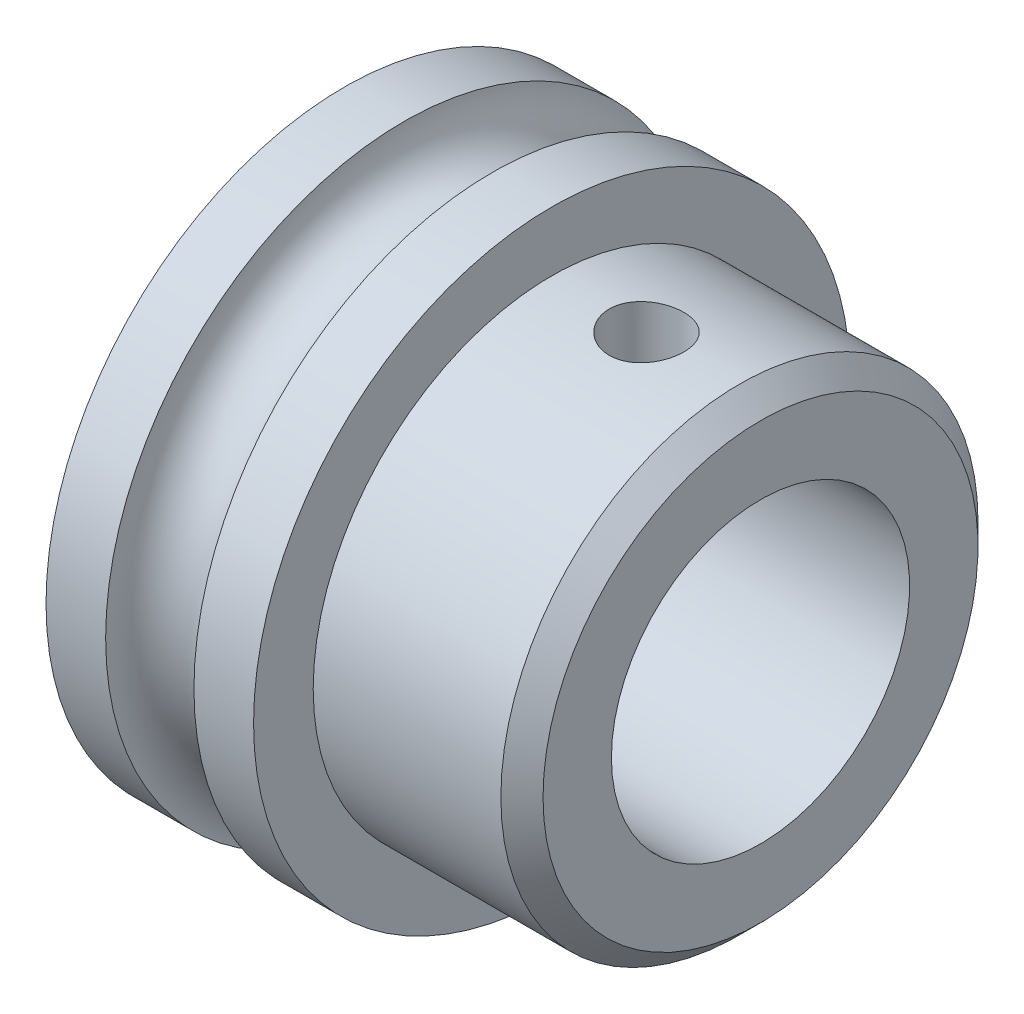
ISO-10303-21;
HEADER;
FILE_DESCRIPTION(('STEP AP214'),'2;1');
FILE_NAME('part.step','',(''),(''),'','','');
FILE_SCHEMA(('AUTOMOTIVE_DESIGN { 1 0 10303 214 1 1 1 1 }'));
ENDSEC;
DATA;
#1=APPLICATION_CONTEXT('core data for automotive mechanical design processes');
#2=APPLICATION_PROTOCOL_DEFINITION('international standard','automotive_design',2000,#1);
#3=PRODUCT_CONTEXT('',#1,'mechanical');
#4=PRODUCT('Part','Part','',(#3));
#5=PRODUCT_RELATED_PRODUCT_CATEGORY('part','',(#4));
#6=PRODUCT_DEFINITION_FORMATION('','',#4);
#7=PRODUCT_DEFINITION_CONTEXT('part definition',#1,'design');
#8=PRODUCT_DEFINITION('design','',#6,#7);
#9=PRODUCT_DEFINITION_SHAPE('','',#8);
#10=(LENGTH_UNIT() NAMED_UNIT(*) SI_UNIT(.MILLI.,.METRE.));
#11=(NAMED_UNIT(*) PLANE_ANGLE_UNIT() SI_UNIT($,.RADIAN.));
#12=(NAMED_UNIT(*) SI_UNIT($,.STERADIAN.) SOLID_ANGLE_UNIT());
#13=UNCERTAINTY_MEASURE_WITH_UNIT(LENGTH_MEASURE(1.E-05),#10,'distance_accuracy_value','');
#14=(GEOMETRIC_REPRESENTATION_CONTEXT(3) GLOBAL_UNCERTAINTY_ASSIGNED_CONTEXT((#13)) GLOBAL_UNIT_ASSIGNED_CONTEXT((#10,
#11,#12)) REPRESENTATION_CONTEXT('',''));
#15=CARTESIAN_POINT('',(0.,0.,0.));
#16=DIRECTION('',(0.,0.,1.));
#17=DIRECTION('',(1.,0.,0.));
#18=AXIS2_PLACEMENT_3D('',#15,#16,#17);
#19=CARTESIAN_POINT('',(-10.922,0.,0.));
#20=DIRECTION('',(-1.,0.,0.));
#21=DIRECTION('',(0.,0.,1.));
#22=AXIS2_PLACEMENT_3D('',#19,#20,#21);
#23=CYLINDRICAL_SURFACE('',#22,5.08000000000001);
#24=CARTESIAN_POINT('',(-0.449012806053457,0.,0.));
#25=DIRECTION('',(-1.,0.,0.));
#26=DIRECTION('',(0.,0.,1.));
#27=AXIS2_PLACEMENT_3D('',#24,#25,#26);
#28=CIRCLE('',#27,5.08000000000001);
#29=CARTESIAN_POINT('',(-0.449012806053457,0.,5.08000000000001));
#30=VERTEX_POINT('',#29);
#31=EDGE_CURVE('E10',#30,#30,#28,.T.);
#32=ORIENTED_EDGE('',*,*,#31,.T.);
#33=EDGE_LOOP('',(#32));
#34=FACE_BOUND('',#33,.T.);
#35=CARTESIAN_POINT('',(-4.445,0.,0.));
#36=DIRECTION('',(-1.,0.,0.));
#37=DIRECTION('',(0.,0.,1.));
#38=AXIS2_PLACEMENT_3D('',#35,#36,#37);
#39=CIRCLE('',#38,5.08000000000001);
#40=CARTESIAN_POINT('',(-4.445,0.,5.08000000000001));
#41=VERTEX_POINT('',#40);
#42=EDGE_CURVE('E67',#41,#41,#39,.T.);
#43=ORIENTED_EDGE('',*,*,#42,.F.);
#44=EDGE_LOOP('',(#43));
#45=FACE_BOUND('',#44,.T.);
#46=CARTESIAN_POINT('',(-2.42718555586603,5.01760509979612,-0.79375));
#47=CARTESIAN_POINT('',(-2.47147787848491,5.01760586359787,-0.793748187643971));
#48=CARTESIAN_POINT('',(-2.51579536011815,5.01819792782707,-0.790030099333588));
#49=CARTESIAN_POINT('',(-2.60318965806246,5.02050040809539,-0.775260843575477));
#50=CARTESIAN_POINT('',(-2.64626524707835,5.0222118933411,-0.76420266514579));
#51=CARTESIAN_POINT('',(-2.72989818058234,5.02655474595517,-0.735093513448723));
#52=CARTESIAN_POINT('',(-2.77045749056613,5.0291853844317,-0.717048079876853));
#53=CARTESIAN_POINT('',(-2.84796731870727,5.03506927270158,-0.674489989017282));
#54=CARTESIAN_POINT('',(-2.88491829980263,5.03832244246708,-0.649978162846328));
#55=CARTESIAN_POINT('',(-2.95448843990186,5.04511639728294,-0.594956043102074));
#56=CARTESIAN_POINT('',(-2.987071746988,5.04865921890405,-0.564400663860542));
#57=CARTESIAN_POINT('',(-3.04667067085245,5.05561514537724,-0.498256182135875));
#58=CARTESIAN_POINT('',(-3.07368597299222,5.05902824288993,-0.462666795380998));
#59=CARTESIAN_POINT('',(-3.12151515432662,5.06536155821058,-0.387233887664786));
#60=CARTESIAN_POINT('',(-3.14229588712793,5.06827910701873,-0.347369106618438));
#61=CARTESIAN_POINT('',(-3.17685320649123,5.07326999984102,-0.264661704544836));
#62=CARTESIAN_POINT('',(-3.19063019400502,5.07534339218025,-0.221819254143437));
#63=CARTESIAN_POINT('',(-3.21067989913461,5.07839798574061,-0.134742340829997));
#64=CARTESIAN_POINT('',(-3.21701273194523,5.07938793177102,-0.0905220313510382));
#65=CARTESIAN_POINT('',(-3.22218112211485,5.08019409086453,-0.00163612307733776));
#66=CARTESIAN_POINT('',(-3.22101712998274,5.08001037445687,0.0430294487990672));
#67=CARTESIAN_POINT('',(-3.21127214927281,5.07849687212833,0.131127528486783));
#68=CARTESIAN_POINT('',(-3.20275584278423,5.07717708113475,0.174567387267618));
#69=CARTESIAN_POINT('',(-3.17864962677835,5.07355085730803,0.259393809171559));
#70=CARTESIAN_POINT('',(-3.16305952278859,5.07124439734955,0.300780315809316));
#71=CARTESIAN_POINT('',(-3.12518274513046,5.0658868659844,0.38051975800661));
#72=CARTESIAN_POINT('',(-3.10286905164265,5.06283279967108,0.418859649553083));
#73=CARTESIAN_POINT('',(-3.05219825026624,5.05632004678997,0.491275324448952));
#74=CARTESIAN_POINT('',(-3.02384071131032,5.0528613313692,0.525350803370853));
#75=CARTESIAN_POINT('',(-2.96152742372027,5.04588106346142,0.588651980301074));
#76=CARTESIAN_POINT('',(-2.92751517928566,5.04235923425492,0.617822061321512));
#77=CARTESIAN_POINT('',(-2.85504932907945,5.03568555295707,0.670049542700766));
#78=CARTESIAN_POINT('',(-2.81659569135901,5.03253370352747,0.693106899084214));
#79=CARTESIAN_POINT('',(-2.73627827394244,5.02695683969123,0.732463167518301));
#80=CARTESIAN_POINT('',(-2.69441147078021,5.02453247880704,0.74875600783221));
#81=CARTESIAN_POINT('',(-2.60848921640204,5.0206963654626,0.774062914430346));
#82=CARTESIAN_POINT('',(-2.56443393355639,5.01928453523211,0.783077539744943));
#83=CARTESIAN_POINT('',(-2.47588113307615,5.01764819737613,0.793495108580192));
#84=CARTESIAN_POINT('',(-2.43139312930419,5.01741136725904,0.794977053080785));
#85=CARTESIAN_POINT('',(-2.34280433165894,5.01811909052553,0.790497145930359));
#86=CARTESIAN_POINT('',(-2.29870352476042,5.0190636040144,0.784535545652492));
#87=CARTESIAN_POINT('',(-2.21238797699542,5.02201624833965,0.765404909864968));
#88=CARTESIAN_POINT('',(-2.17016422629796,5.0240185232959,0.752275542632783));
#89=CARTESIAN_POINT('',(-2.08851657004054,5.02885622496,0.719223454368133));
#90=CARTESIAN_POINT('',(-2.04909281362496,5.03169169600756,0.699300371789363));
#91=CARTESIAN_POINT('',(-1.97381102394253,5.03790519025758,0.653037807365681));
#92=CARTESIAN_POINT('',(-1.93798465819029,5.04128744553475,0.62664737222177));
#93=CARTESIAN_POINT('',(-1.87124083944672,5.04820080241047,0.568269735935022));
#94=CARTESIAN_POINT('',(-1.84032368869579,5.05173191315651,0.536282190455509));
#95=CARTESIAN_POINT('',(-1.78399047743927,5.05858379592671,0.46726966098144));
#96=CARTESIAN_POINT('',(-1.75862689284948,5.06190236798872,0.430201591204772));
#97=CARTESIAN_POINT('',(-1.71448710826913,5.06792067865716,0.352284858768145));
#98=CARTESIAN_POINT('',(-1.69571071578144,5.07062043534638,0.31143630662909));
#99=CARTESIAN_POINT('',(-1.66536136346331,5.07508731512396,0.227279093249617));
#100=CARTESIAN_POINT('',(-1.65376016042902,5.07685809066192,0.183980819368424));
#101=CARTESIAN_POINT('',(-1.63799925874241,5.07928286208152,0.0960208740522106));
#102=CARTESIAN_POINT('',(-1.63383902491051,5.07993693827978,0.0513593009052815));
#103=CARTESIAN_POINT('',(-1.633092067648,5.08005368965632,-0.037551412447278));
#104=CARTESIAN_POINT('',(-1.63642521694196,5.07952896982697,-0.0817998836629871));
#105=CARTESIAN_POINT('',(-1.65039809375328,5.07737261769528,-0.169098784060097));
#106=CARTESIAN_POINT('',(-1.66103779186615,5.0757409898476,-0.212149218062157));
#107=CARTESIAN_POINT('',(-1.68929246082473,5.07155336151322,-0.295804860011351));
#108=CARTESIAN_POINT('',(-1.70690142099309,5.06899815773382,-0.336412140393966));
#109=CARTESIAN_POINT('',(-1.74858608709666,5.06324340508888,-0.414108288028914));
#110=CARTESIAN_POINT('',(-1.77266203857992,5.06004383175813,-0.45119702161162));
#111=CARTESIAN_POINT('',(-1.82688495408511,5.05331502106095,-0.521208695915139));
#112=CARTESIAN_POINT('',(-1.85709091065915,5.04978277424563,-0.554085663107412));
#113=CARTESIAN_POINT('',(-1.92259231731843,5.04280845886785,-0.614333012939016));
#114=CARTESIAN_POINT('',(-1.95788895880768,5.03936641163882,-0.641702102934607));
#115=CARTESIAN_POINT('',(-2.03282550647854,5.03293950694832,-0.690308981147045));
#116=CARTESIAN_POINT('',(-2.07249073524508,5.02995758455756,-0.711508115170812));
#117=CARTESIAN_POINT('',(-2.15484777748423,5.02482305123286,-0.746911020803771));
#118=CARTESIAN_POINT('',(-2.19753644097602,5.02266959178294,-0.761121953937972));
#119=CARTESIAN_POINT('',(-2.27153744821669,5.01992613196976,-0.778970079589324));
#120=CARTESIAN_POINT('',(-2.30239586386009,5.01906044059113,-0.784503921449308));
#121=CARTESIAN_POINT('',(-2.36456051634939,5.01789965866719,-0.791894495325261));
#122=CARTESIAN_POINT('',(-2.39586674659206,5.01760455971695,-0.793751281504998));
#123=CARTESIAN_POINT('',(-2.42718555586603,5.01760509979612,-0.79375));
#124=B_SPLINE_CURVE_WITH_KNOTS('',3,(#46,#47,#48,#49,#50,#51,#52,#53,#54,#55,#56,#57,#58,#59,
#60,#61,#62,#63,#64,#65,#66,#67,#68,#69,#70,#71,#72,#73,#74,#75,#76,#77,#78,#79,#80,#81,#82,#83,
#84,#85,#86,#87,#88,#89,#90,#91,#92,#93,#94,#95,#96,#97,#98,#99,#100,#101,#102,#103,#104,#105,
#106,#107,#108,#109,#110,#111,#112,#113,#114,#115,#116,#117,#118,#119,#120,#121,#122,#123),
.UNSPECIFIED.,.T.,.F.,(4,2,2,2,2,2,2,2,2,2,2,2,2,2,2,2,2,2,2,2,2,2,2,2,2,2,2,2,2,2,2,2,2,2,2,2,
2,2,4),(0.,0.132762475102721,0.265651942830155,0.398436267010929,0.531203532908968,
0.665001394300081,0.798806814310615,0.933311500208673,1.06780848508856,1.201211712106,
1.33460692255917,1.46684040879163,1.59907753060016,1.73185332104328,1.8646385846719,
1.99884043776792,2.13304325629522,2.2673662743606,2.40167897426527,2.53458008459729,
2.66747670689726,2.79964519269812,2.93182071330755,3.0650730952453,3.19833367781194,
3.33280376108561,3.46726991442069,3.60120335202525,3.73512715629804,3.86762572316967,
4.00012375681678,4.13250776497607,4.2648968003928,4.39862607826364,4.53238670455244,
4.66696812876592,4.80141134468758,4.89528819827329,4.98916366902383),.UNSPECIFIED.);
#125=CARTESIAN_POINT('',(-2.42718555586603,5.01760509979612,-0.79375));
#126=VERTEX_POINT('',#125);
#127=EDGE_CURVE('E70',#126,#126,#124,.T.);
#128=ORIENTED_EDGE('',*,*,#127,.F.);
#129=EDGE_LOOP('',(#128));
#130=FACE_BOUND('',#129,.T.);
#131=ADVANCED_FACE('F31',(#34,#45,#130),#23,.T.);
#132=CARTESIAN_POINT('',(-10.922,0.,0.));
#133=DIRECTION('',(-1.,0.,0.));
#134=DIRECTION('',(0.,0.,1.));
#135=AXIS2_PLACEMENT_3D('',#132,#133,#134);
#136=CYLINDRICAL_SURFACE('',#135,3.175);
#137=CARTESIAN_POINT('',(-8.8646,0.,0.));
#138=DIRECTION('',(-1.,0.,0.));
#139=DIRECTION('',(0.,0.,1.));
#140=AXIS2_PLACEMENT_3D('',#137,#138,#139);
#141=CIRCLE('',#140,3.175);
#142=CARTESIAN_POINT('',(-8.8646,0.,3.175));
#143=VERTEX_POINT('',#142);
#144=EDGE_CURVE('E52',#143,#143,#141,.T.);
#145=ORIENTED_EDGE('',*,*,#144,.T.);
#146=EDGE_LOOP('',(#145));
#147=FACE_BOUND('',#146,.T.);
#148=CARTESIAN_POINT('',(0.,0.,0.));
#149=DIRECTION('',(-1.,0.,0.));
#150=DIRECTION('',(0.,0.,1.));
#151=AXIS2_PLACEMENT_3D('',#148,#149,#150);
#152=CIRCLE('',#151,3.175);
#153=CARTESIAN_POINT('',(0.,0.,3.175));
#154=VERTEX_POINT('',#153);
#155=EDGE_CURVE('E47',#154,#154,#152,.T.);
#156=ORIENTED_EDGE('',*,*,#155,.F.);
#157=EDGE_LOOP('',(#156));
#158=FACE_BOUND('',#157,.T.);
#159=CARTESIAN_POINT('',(-2.42718555586603,3.07418053105214,-0.79375));
#160=CARTESIAN_POINT('',(-2.38335444245783,3.07418136795391,-0.793748754954467));
#161=CARTESIAN_POINT('',(-2.33950955056739,3.07512817233802,-0.790107082952655));
#162=CARTESIAN_POINT('',(-2.25307884982514,3.07880341258223,-0.775659842341841));
#163=CARTESIAN_POINT('',(-2.21049378882818,3.08153288532631,-0.764850104391599));
#164=CARTESIAN_POINT('',(-2.12784543248131,3.08844545039078,-0.736438455880647));
#165=CARTESIAN_POINT('',(-2.08777895902831,3.09262666548804,-0.718845313593124));
#166=CARTESIAN_POINT('',(-2.01116186018738,3.10196925974547,-0.677392962351167));
#167=CARTESIAN_POINT('',(-1.97461138415631,3.10713068051635,-0.653533487368201));
#168=CARTESIAN_POINT('',(-1.90525948349451,3.11797927441417,-0.599664925671336));
#169=CARTESIAN_POINT('',(-1.87254683775468,3.12367484744913,-0.569543211845986));
#170=CARTESIAN_POINT('',(-1.81258131315683,3.13487712976506,-0.50424780535201));
#171=CARTESIAN_POINT('',(-1.78532894473118,3.14038382134936,-0.469073640902261));
#172=CARTESIAN_POINT('',(-1.73669434489304,3.15068081927675,-0.394063601342555));
#173=CARTESIAN_POINT('',(-1.71539932762475,3.15546005749659,-0.354169527941947));
#174=CARTESIAN_POINT('',(-1.67985099384744,3.16366782786529,-0.271228561012956));
#175=CARTESIAN_POINT('',(-1.66559663838286,3.16709655928662,-0.228182133738942));
#176=CARTESIAN_POINT('',(-1.64481861838732,3.1721576093429,-0.141083905904446));
#177=CARTESIAN_POINT('',(-1.63814419379234,3.17382491295568,-0.0970701384567997));
#178=CARTESIAN_POINT('',(-1.63224227044604,3.17529716129069,-0.00851815011592975));
#179=CARTESIAN_POINT('',(-1.63301367068948,3.17510238135704,0.0360199922658365));
#180=CARTESIAN_POINT('',(-1.64187307082045,3.17289845147747,0.123310846193082));
#181=CARTESIAN_POINT('',(-1.64979833907063,3.17092965743227,0.166081246133347));
#182=CARTESIAN_POINT('',(-1.67247893410643,3.16544590596641,0.249664733884613));
#183=CARTESIAN_POINT('',(-1.68723462447336,3.16193086624005,0.290477717375285));
#184=CARTESIAN_POINT('',(-1.72328887205917,3.15368784330034,0.369416570904559));
#185=CARTESIAN_POINT('',(-1.74464534254613,3.14894918753179,0.407514829627163));
#186=CARTESIAN_POINT('',(-1.79325098398544,3.13877294459564,0.479643775232763));
#187=CARTESIAN_POINT('',(-1.82050118013403,3.13333523589666,0.51367375284912));
#188=CARTESIAN_POINT('',(-1.88099308144543,3.12217979121823,0.577670640348684));
#189=CARTESIAN_POINT('',(-1.91437698418645,3.11645845949479,0.607502657765939));
#190=CARTESIAN_POINT('',(-1.98573354746506,3.10551526316554,0.661174998420646));
#191=CARTESIAN_POINT('',(-2.02370642235442,3.10029342191146,0.685015041611525));
#192=CARTESIAN_POINT('',(-2.10342764170833,3.09092757744048,0.726113077411687));
#193=CARTESIAN_POINT('',(-2.14519340024047,3.08678892332916,0.743338593782827));
#194=CARTESIAN_POINT('',(-2.2311564419803,3.08012668244436,0.770481711380095));
#195=CARTESIAN_POINT('',(-2.27535320268067,3.07760275007244,0.780400876451372));
#196=CARTESIAN_POINT('',(-2.36367269759962,3.07452825542427,0.792425910276193));
#197=CARTESIAN_POINT('',(-2.40776655524819,3.07392733287233,0.794731225469482));
#198=CARTESIAN_POINT('',(-2.49570902072959,3.0746298155523,0.792009144488686));
#199=CARTESIAN_POINT('',(-2.53955765076555,3.07593304548402,0.786982423316994));
#200=CARTESIAN_POINT('',(-2.62502433498915,3.08024873520573,0.769913834800208));
#201=CARTESIAN_POINT('',(-2.66666714655227,3.08323288049414,0.757988091679454));
#202=CARTESIAN_POINT('',(-2.74736254373394,3.09054728051031,0.727588740930422));
#203=CARTESIAN_POINT('',(-2.7864148218661,3.09487769468935,0.709114357648733));
#204=CARTESIAN_POINT('',(-2.86166566158891,3.10450273527111,0.665724687069857));
#205=CARTESIAN_POINT('',(-2.89779321257971,3.10981461032609,0.640690156842812));
#206=CARTESIAN_POINT('',(-2.96540786105546,3.1207617387527,0.585041607516725));
#207=CARTESIAN_POINT('',(-2.99689419440243,3.12639704516289,0.554426671501818));
#208=CARTESIAN_POINT('',(-3.05514056188231,3.13752675462535,0.487571034781626));
#209=CARTESIAN_POINT('',(-3.08176262572528,3.14301410404633,0.451208737321952));
#210=CARTESIAN_POINT('',(-3.12852269362305,3.15308366274861,0.374414004388899));
#211=CARTESIAN_POINT('',(-3.14866103588913,3.15766591923757,0.333981781360088));
#212=CARTESIAN_POINT('',(-3.18170717182865,3.16538011746915,0.250474322624053));
#213=CARTESIAN_POINT('',(-3.19466696615638,3.16852246032115,0.207420671190881));
#214=CARTESIAN_POINT('',(-3.2131442121042,3.17304830653163,0.119657622253054));
#215=CARTESIAN_POINT('',(-3.21866310001568,3.17443214932407,0.0749485460014873));
#216=CARTESIAN_POINT('',(-3.22202108009161,3.17527121968244,-0.0135600491143901));
#217=CARTESIAN_POINT('',(-3.22006378746049,3.17477758236007,-0.0573514751542887));
#218=CARTESIAN_POINT('',(-3.20899134295115,3.1720305531308,-0.143960450279199));
#219=CARTESIAN_POINT('',(-3.19987640394938,3.16977721355944,-0.186778028288579));
#220=CARTESIAN_POINT('',(-3.17485660642286,3.16377187327833,-0.270010759543073));
#221=CARTESIAN_POINT('',(-3.15898856479755,3.16002800573993,-0.310437605073684));
#222=CARTESIAN_POINT('',(-3.12094640876944,3.15143585574997,-0.388077910851665));
#223=CARTESIAN_POINT('',(-3.09877149943456,3.14658743409321,-0.425290965254134));
#224=CARTESIAN_POINT('',(-3.04812408888085,3.13616379434565,-0.496412780686471));
#225=CARTESIAN_POINT('',(-3.0195134424333,3.13057394700607,-0.530221021963591));
#226=CARTESIAN_POINT('',(-2.95707491711182,3.11936327685983,-0.592625672340306));
#227=CARTESIAN_POINT('',(-2.92324571746328,3.11374244655986,-0.621220758022866));
#228=CARTESIAN_POINT('',(-2.85057068334375,3.10298683964417,-0.672911108517897));
#229=CARTESIAN_POINT('',(-2.81164303290737,3.09786308710998,-0.695893816685733));
#230=CARTESIAN_POINT('',(-2.73035401073977,3.088830147179,-0.73495447418865));
#231=CARTESIAN_POINT('',(-2.68799516401837,3.08492007669321,-0.751037447121648));
#232=CARTESIAN_POINT('',(-2.60929005272892,3.07936827563419,-0.773447882048922));
#233=CARTESIAN_POINT('',(-2.57332035663753,3.07743751260823,-0.781044579160439));
#234=CARTESIAN_POINT('',(-2.50063214109611,3.07484334373159,-0.791195944729675));
#235=CARTESIAN_POINT('',(-2.46391368579209,3.07417982977319,-0.793751043281599));
#236=CARTESIAN_POINT('',(-2.42718555586603,3.07418053105214,-0.79375));
#237=B_SPLINE_CURVE_WITH_KNOTS('',3,(#159,#160,#161,#162,#163,#164,#165,#166,#167,#168,#169,
#170,#171,#172,#173,#174,#175,#176,#177,#178,#179,#180,#181,#182,#183,#184,#185,#186,#187,#188,
#189,#190,#191,#192,#193,#194,#195,#196,#197,#198,#199,#200,#201,#202,#203,#204,#205,#206,#207,
#208,#209,#210,#211,#212,#213,#214,#215,#216,#217,#218,#219,#220,#221,#222,#223,#224,#225,#226,
#227,#228,#229,#230,#231,#232,#233,#234,#235,#236),.UNSPECIFIED.,.T.,.F.,(4,2,2,2,2,2,2,2,2,2,2,
2,2,2,2,2,2,2,2,2,2,2,2,2,2,2,2,2,2,2,2,2,2,2,2,2,2,2,4),(0.,0.131358462735963,0.26279339787403,
0.39405900584564,0.525330187419073,0.659206054533127,0.793094430669005,0.928851001033824,
1.06458753248495,1.19757428438065,1.33054137198504,1.46055798400783,1.59058151757162,
1.72177987572829,1.85300107383423,1.98777373133625,2.1225526865298,2.25798517159711,
2.39338866038174,2.52521584983888,2.657030903779,2.78668926087466,2.91636298048343,
3.04858053557325,3.18081983493044,3.31636792578531,3.45190894488001,3.58645483113243,
3.72097474275662,3.8518574414251,3.98273624764234,4.11291048304751,4.24310113318881,
4.3764107816185,4.50975422519092,4.64558531534928,4.78131734030944,4.89139810125845,
5.00146947091141),.UNSPECIFIED.);
#238=CARTESIAN_POINT('',(-2.42718555586603,3.07418053105214,-0.79375));
#239=VERTEX_POINT('',#238);
#240=EDGE_CURVE('E35',#239,#239,#237,.T.);
#241=ORIENTED_EDGE('',*,*,#240,.F.);
#242=EDGE_LOOP('',(#241));
#243=FACE_BOUND('',#242,.T.);
#244=ADVANCED_FACE('F100',(#147,#158,#243),#136,.F.);
#245=CARTESIAN_POINT('',(0.,0.,0.));
#246=DIRECTION('',(-1.,0.,0.));
#247=DIRECTION('',(0.,0.,1.));
#248=AXIS2_PLACEMENT_3D('',#245,#246,#247);
#249=CONICAL_SURFACE('',#248,4.63098719394654,0.785398163397455);
#250=ORIENTED_EDGE('',*,*,#31,.F.);
#251=EDGE_LOOP('',(#250));
#252=FACE_BOUND('',#251,.T.);
#253=CARTESIAN_POINT('',(0.,0.,0.));
#254=DIRECTION('',(-1.,0.,0.));
#255=DIRECTION('',(0.,0.,1.));
#256=AXIS2_PLACEMENT_3D('',#253,#254,#255);
#257=CIRCLE('',#256,4.63098719394654);
#258=CARTESIAN_POINT('',(0.,0.,4.63098719394654));
#259=VERTEX_POINT('',#258);
#260=EDGE_CURVE('E43',#259,#259,#257,.T.);
#261=ORIENTED_EDGE('',*,*,#260,.T.);
#262=EDGE_LOOP('',(#261));
#263=FACE_BOUND('',#262,.T.);
#264=ADVANCED_FACE('F104',(#252,#263),#249,.T.);
#265=CARTESIAN_POINT('',(0.,0.,-3.175));
#266=DIRECTION('',(-1.,0.,0.));
#267=DIRECTION('',(0.,0.,1.));
#268=AXIS2_PLACEMENT_3D('',#265,#266,#267);
#269=PLANE('',#268);
#270=ORIENTED_EDGE('',*,*,#260,.F.);
#271=EDGE_LOOP('',(#270));
#272=FACE_BOUND('',#271,.T.);
#273=ORIENTED_EDGE('',*,*,#155,.T.);
#274=EDGE_LOOP('',(#273));
#275=FACE_BOUND('',#274,.T.);
#276=ADVANCED_FACE('F98',(#272,#275),#269,.F.);
#277=CARTESIAN_POINT('',(-8.8646,0.,-6.35));
#278=DIRECTION('',(1.,0.,0.));
#279=DIRECTION('',(0.,0.,-1.));
#280=AXIS2_PLACEMENT_3D('',#277,#278,#279);
#281=PLANE('',#280);
#282=ORIENTED_EDGE('',*,*,#144,.F.);
#283=EDGE_LOOP('',(#282));
#284=FACE_BOUND('',#283,.T.);
#285=CARTESIAN_POINT('',(-8.8646,0.,0.));
#286=DIRECTION('',(-1.,0.,0.));
#287=DIRECTION('',(0.,0.,1.));
#288=AXIS2_PLACEMENT_3D('',#285,#286,#287);
#289=CIRCLE('',#288,6.35);
#290=CARTESIAN_POINT('',(-8.8646,0.,6.35));
#291=VERTEX_POINT('',#290);
#292=EDGE_CURVE('E55',#291,#291,#289,.T.);
#293=ORIENTED_EDGE('',*,*,#292,.T.);
#294=EDGE_LOOP('',(#293));
#295=FACE_BOUND('',#294,.T.);
#296=ADVANCED_FACE('F95',(#284,#295),#281,.F.);
#297=CARTESIAN_POINT('',(-10.922,0.,0.));
#298=DIRECTION('',(-1.,0.,0.));
#299=DIRECTION('',(0.,0.,1.));
#300=AXIS2_PLACEMENT_3D('',#297,#298,#299);
#301=CYLINDRICAL_SURFACE('',#300,6.35);
#302=ORIENTED_EDGE('',*,*,#292,.F.);
#303=EDGE_LOOP('',(#302));
#304=FACE_BOUND('',#303,.T.);
#305=CARTESIAN_POINT('',(-7.5946,0.,0.));
#306=DIRECTION('',(-1.,0.,0.));
#307=DIRECTION('',(0.,0.,1.));
#308=AXIS2_PLACEMENT_3D('',#305,#306,#307);
#309=CIRCLE('',#308,6.35);
#310=CARTESIAN_POINT('',(-7.5946,0.,6.35));
#311=VERTEX_POINT('',#310);
#312=EDGE_CURVE('E58',#311,#311,#309,.T.);
#313=ORIENTED_EDGE('',*,*,#312,.T.);
#314=EDGE_LOOP('',(#313));
#315=FACE_BOUND('',#314,.T.);
#316=ADVANCED_FACE('F91',(#304,#315),#301,.T.);
#317=CARTESIAN_POINT('',(-6.6548,0.,0.));
#318=DIRECTION('',(-1.,0.,0.));
#319=DIRECTION('',(0.,0.,1.));
#320=AXIS2_PLACEMENT_3D('',#317,#318,#319);
#321=TOROIDAL_SURFACE('',#320,6.35,0.9398);
#322=ORIENTED_EDGE('',*,*,#312,.F.);
#323=EDGE_LOOP('',(#322));
#324=FACE_BOUND('',#323,.T.);
#325=CARTESIAN_POINT('',(-5.715,0.,0.));
#326=DIRECTION('',(-1.,0.,0.));
#327=DIRECTION('',(0.,0.,1.));
#328=AXIS2_PLACEMENT_3D('',#325,#326,#327);
#329=CIRCLE('',#328,6.35);
#330=CARTESIAN_POINT('',(-5.715,0.,6.35));
#331=VERTEX_POINT('',#330);
#332=EDGE_CURVE('E61',#331,#331,#329,.T.);
#333=ORIENTED_EDGE('',*,*,#332,.T.);
#334=EDGE_LOOP('',(#333));
#335=FACE_BOUND('',#334,.T.);
#336=ADVANCED_FACE('F87',(#324,#335),#321,.F.);
#337=CARTESIAN_POINT('',(-10.922,0.,0.));
#338=DIRECTION('',(-1.,0.,0.));
#339=DIRECTION('',(0.,0.,1.));
#340=AXIS2_PLACEMENT_3D('',#337,#338,#339);
#341=CYLINDRICAL_SURFACE('',#340,6.35);
#342=ORIENTED_EDGE('',*,*,#332,.F.);
#343=EDGE_LOOP('',(#342));
#344=FACE_BOUND('',#343,.T.);
#345=CARTESIAN_POINT('',(-4.445,0.,0.));
#346=DIRECTION('',(-1.,0.,0.));
#347=DIRECTION('',(0.,0.,1.));
#348=AXIS2_PLACEMENT_3D('',#345,#346,#347);
#349=CIRCLE('',#348,6.35);
#350=CARTESIAN_POINT('',(-4.445,0.,6.35));
#351=VERTEX_POINT('',#350);
#352=EDGE_CURVE('E64',#351,#351,#349,.T.);
#353=ORIENTED_EDGE('',*,*,#352,.T.);
#354=EDGE_LOOP('',(#353));
#355=FACE_BOUND('',#354,.T.);
#356=ADVANCED_FACE('F83',(#344,#355),#341,.T.);
#357=CARTESIAN_POINT('',(-4.445,0.,-6.35));
#358=DIRECTION('',(-1.,0.,0.));
#359=DIRECTION('',(0.,0.,1.));
#360=AXIS2_PLACEMENT_3D('',#357,#358,#359);
#361=PLANE('',#360);
#362=ORIENTED_EDGE('',*,*,#352,.F.);
#363=EDGE_LOOP('',(#362));
#364=FACE_BOUND('',#363,.T.);
#365=ORIENTED_EDGE('',*,*,#42,.T.);
#366=EDGE_LOOP('',(#365));
#367=FACE_BOUND('',#366,.T.);
#368=ADVANCED_FACE('F78',(#364,#367),#361,.F.);
#369=CARTESIAN_POINT('',(-2.42718555586603,6.35,0.));
#370=DIRECTION('',(0.,-1.,0.));
#371=DIRECTION('',(0.,0.,-1.));
#372=AXIS2_PLACEMENT_3D('',#369,#370,#371);
#373=CYLINDRICAL_SURFACE('',#372,0.79375);
#374=ORIENTED_EDGE('',*,*,#240,.T.);
#375=EDGE_LOOP('',(#374));
#376=FACE_BOUND('',#375,.T.);
#377=ORIENTED_EDGE('',*,*,#127,.T.);
#378=EDGE_LOOP('',(#377));
#379=FACE_BOUND('',#378,.T.);
#380=ADVANCED_FACE('F74',(#376,#379),#373,.F.);
#381=CLOSED_SHELL('',(#131,#244,#264,#276,#296,#316,#336,#356,#368,#380));
#382=MANIFOLD_SOLID_BREP('B2',#381);
#383=ADVANCED_BREP_SHAPE_REPRESENTATION('',(#18,#382),#14);
#384=SHAPE_DEFINITION_REPRESENTATION(#9,#383);
ENDSEC;
END-ISO-10303-21;
